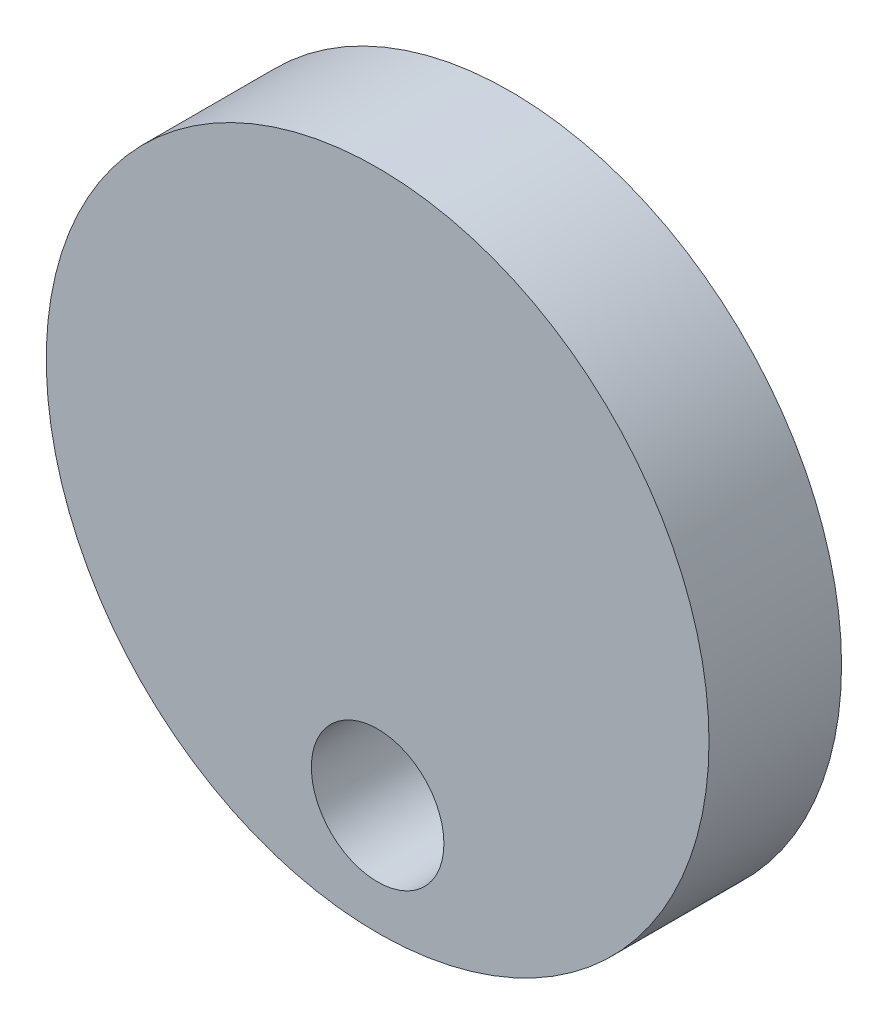
ISO-10303-21;
HEADER;
FILE_DESCRIPTION(('STEP AP214'),'2;1');
FILE_NAME('part.step','',(''),(''),'','','');
FILE_SCHEMA(('AUTOMOTIVE_DESIGN { 1 0 10303 214 1 1 1 1 }'));
ENDSEC;
DATA;
#1=APPLICATION_CONTEXT('core data for automotive mechanical design processes');
#2=APPLICATION_PROTOCOL_DEFINITION('international standard','automotive_design',2000,#1);
#3=PRODUCT_CONTEXT('',#1,'mechanical');
#4=PRODUCT('Part','Part','',(#3));
#5=PRODUCT_RELATED_PRODUCT_CATEGORY('part','',(#4));
#6=PRODUCT_DEFINITION_FORMATION('','',#4);
#7=PRODUCT_DEFINITION_CONTEXT('part definition',#1,'design');
#8=PRODUCT_DEFINITION('design','',#6,#7);
#9=PRODUCT_DEFINITION_SHAPE('','',#8);
#10=(LENGTH_UNIT() NAMED_UNIT(*) SI_UNIT(.MILLI.,.METRE.));
#11=(NAMED_UNIT(*) PLANE_ANGLE_UNIT() SI_UNIT($,.RADIAN.));
#12=(NAMED_UNIT(*) SI_UNIT($,.STERADIAN.) SOLID_ANGLE_UNIT());
#13=UNCERTAINTY_MEASURE_WITH_UNIT(LENGTH_MEASURE(1.E-05),#10,'distance_accuracy_value','');
#14=(GEOMETRIC_REPRESENTATION_CONTEXT(3) GLOBAL_UNCERTAINTY_ASSIGNED_CONTEXT((#13)) GLOBAL_UNIT_ASSIGNED_CONTEXT((#10,
#11,#12)) REPRESENTATION_CONTEXT('',''));
#15=CARTESIAN_POINT('',(0.,0.,0.));
#16=DIRECTION('',(0.,0.,1.));
#17=DIRECTION('',(1.,0.,0.));
#18=AXIS2_PLACEMENT_3D('',#15,#16,#17);
#19=CARTESIAN_POINT('',(0.,0.,6.));
#20=DIRECTION('',(0.,0.,1.));
#21=DIRECTION('',(1.,0.,0.));
#22=AXIS2_PLACEMENT_3D('',#19,#20,#21);
#23=PLANE('',#22);
#24=CARTESIAN_POINT('',(0.,0.,6.));
#25=DIRECTION('',(0.,0.,1.));
#26=DIRECTION('',(1.,0.,0.));
#27=AXIS2_PLACEMENT_3D('',#24,#25,#26);
#28=CIRCLE('',#27,15.);
#29=CARTESIAN_POINT('',(15.,0.,6.));
#30=VERTEX_POINT('',#29);
#31=EDGE_CURVE('E10',#30,#30,#28,.T.);
#32=ORIENTED_EDGE('',*,*,#31,.T.);
#33=EDGE_LOOP('',(#32));
#34=FACE_BOUND('',#33,.T.);
#35=CARTESIAN_POINT('',(0.,-10.,6.));
#36=DIRECTION('',(0.,0.,1.));
#37=DIRECTION('',(1.,0.,0.));
#38=AXIS2_PLACEMENT_3D('',#35,#36,#37);
#39=CIRCLE('',#38,3.);
#40=CARTESIAN_POINT('',(3.,-10.,6.));
#41=VERTEX_POINT('',#40);
#42=EDGE_CURVE('E41',#41,#41,#39,.T.);
#43=ORIENTED_EDGE('',*,*,#42,.F.);
#44=EDGE_LOOP('',(#43));
#45=FACE_BOUND('',#44,.T.);
#46=ADVANCED_FACE('F30',(#34,#45),#23,.T.);
#47=CARTESIAN_POINT('',(0.,0.,0.));
#48=DIRECTION('',(0.,0.,1.));
#49=DIRECTION('',(1.,0.,0.));
#50=AXIS2_PLACEMENT_3D('',#47,#48,#49);
#51=PLANE('',#50);
#52=CARTESIAN_POINT('',(0.,0.,0.));
#53=DIRECTION('',(0.,0.,1.));
#54=DIRECTION('',(1.,0.,0.));
#55=AXIS2_PLACEMENT_3D('',#52,#53,#54);
#56=CIRCLE('',#55,15.);
#57=CARTESIAN_POINT('',(15.,0.,0.));
#58=VERTEX_POINT('',#57);
#59=EDGE_CURVE('E34',#58,#58,#56,.T.);
#60=ORIENTED_EDGE('',*,*,#59,.F.);
#61=EDGE_LOOP('',(#60));
#62=FACE_BOUND('',#61,.T.);
#63=CARTESIAN_POINT('',(0.,-10.,0.));
#64=DIRECTION('',(0.,0.,1.));
#65=DIRECTION('',(1.,0.,0.));
#66=AXIS2_PLACEMENT_3D('',#63,#64,#65);
#67=CIRCLE('',#66,3.);
#68=CARTESIAN_POINT('',(3.,-10.,0.));
#69=VERTEX_POINT('',#68);
#70=EDGE_CURVE('E43',#69,#69,#67,.T.);
#71=ORIENTED_EDGE('',*,*,#70,.T.);
#72=EDGE_LOOP('',(#71));
#73=FACE_BOUND('',#72,.T.);
#74=ADVANCED_FACE('F53',(#62,#73),#51,.F.);
#75=CARTESIAN_POINT('',(0.,0.,6.));
#76=DIRECTION('',(0.,0.,-1.));
#77=DIRECTION('',(-1.,0.,0.));
#78=AXIS2_PLACEMENT_3D('',#75,#76,#77);
#79=CYLINDRICAL_SURFACE('',#78,15.);
#80=ORIENTED_EDGE('',*,*,#31,.F.);
#81=EDGE_LOOP('',(#80));
#82=FACE_BOUND('',#81,.T.);
#83=ORIENTED_EDGE('',*,*,#59,.T.);
#84=EDGE_LOOP('',(#83));
#85=FACE_BOUND('',#84,.T.);
#86=ADVANCED_FACE('F32',(#82,#85),#79,.T.);
#87=CARTESIAN_POINT('',(0.,-10.,6.));
#88=DIRECTION('',(0.,0.,-1.));
#89=DIRECTION('',(-1.,0.,0.));
#90=AXIS2_PLACEMENT_3D('',#87,#88,#89);
#91=CYLINDRICAL_SURFACE('',#90,3.);
#92=ORIENTED_EDGE('',*,*,#42,.T.);
#93=EDGE_LOOP('',(#92));
#94=FACE_BOUND('',#93,.T.);
#95=ORIENTED_EDGE('',*,*,#70,.F.);
#96=EDGE_LOOP('',(#95));
#97=FACE_BOUND('',#96,.T.);
#98=ADVANCED_FACE('F49',(#94,#97),#91,.F.);
#99=CLOSED_SHELL('',(#46,#74,#86,#98));
#100=MANIFOLD_SOLID_BREP('B2',#99);
#101=ADVANCED_BREP_SHAPE_REPRESENTATION('',(#18,#100),#14);
#102=SHAPE_DEFINITION_REPRESENTATION(#9,#101);
ENDSEC;
END-ISO-10303-21;
